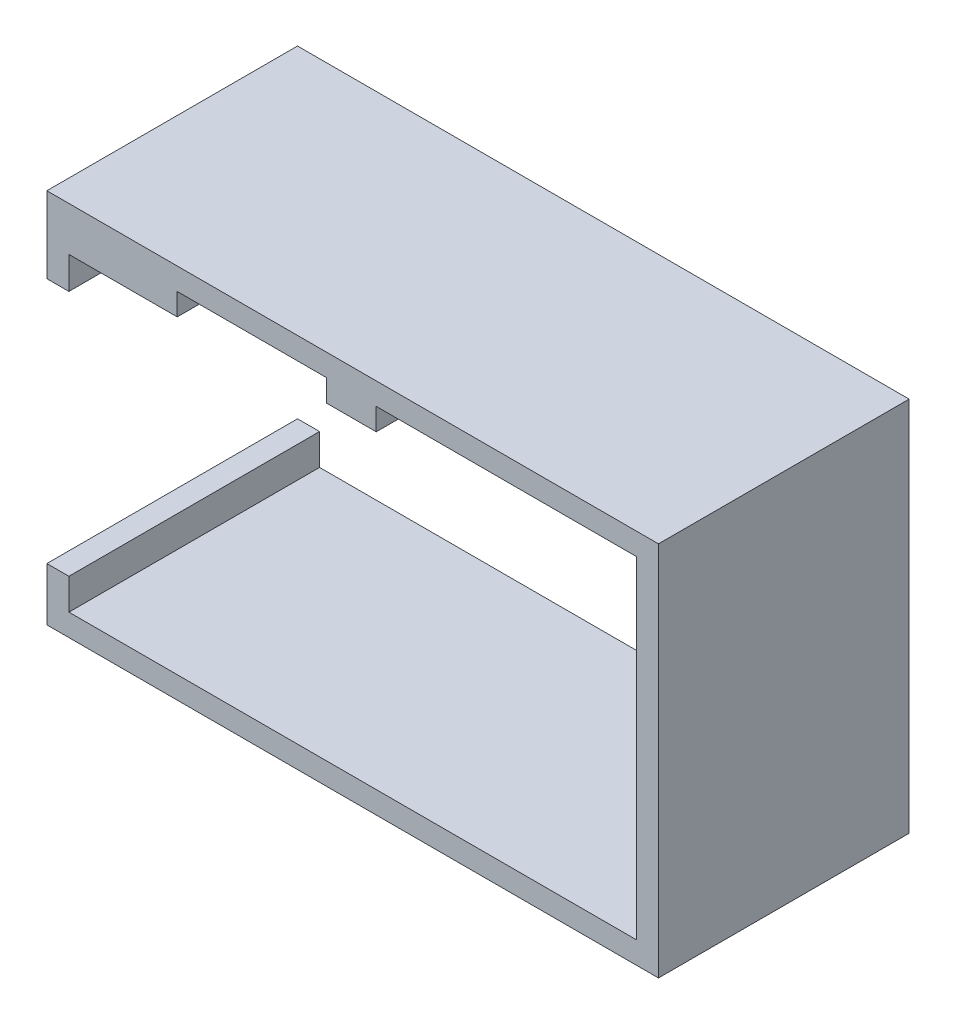
ISO-10303-21;
HEADER;
FILE_DESCRIPTION(('STEP AP214'),'2;1');
FILE_NAME('part.step','',(''),(''),'','','');
FILE_SCHEMA(('AUTOMOTIVE_DESIGN { 1 0 10303 214 1 1 1 1 }'));
ENDSEC;
DATA;
#1=APPLICATION_CONTEXT('core data for automotive mechanical design processes');
#2=APPLICATION_PROTOCOL_DEFINITION('international standard','automotive_design',2000,#1);
#3=PRODUCT_CONTEXT('',#1,'mechanical');
#4=PRODUCT('Part','Part','',(#3));
#5=PRODUCT_RELATED_PRODUCT_CATEGORY('part','',(#4));
#6=PRODUCT_DEFINITION_FORMATION('','',#4);
#7=PRODUCT_DEFINITION_CONTEXT('part definition',#1,'design');
#8=PRODUCT_DEFINITION('design','',#6,#7);
#9=PRODUCT_DEFINITION_SHAPE('','',#8);
#10=(LENGTH_UNIT() NAMED_UNIT(*) SI_UNIT(.MILLI.,.METRE.));
#11=(NAMED_UNIT(*) PLANE_ANGLE_UNIT() SI_UNIT($,.RADIAN.));
#12=(NAMED_UNIT(*) SI_UNIT($,.STERADIAN.) SOLID_ANGLE_UNIT());
#13=UNCERTAINTY_MEASURE_WITH_UNIT(LENGTH_MEASURE(1.E-05),#10,'distance_accuracy_value','');
#14=(GEOMETRIC_REPRESENTATION_CONTEXT(3) GLOBAL_UNCERTAINTY_ASSIGNED_CONTEXT((#13)) GLOBAL_UNIT_ASSIGNED_CONTEXT((#10,
#11,#12)) REPRESENTATION_CONTEXT('',''));
#15=CARTESIAN_POINT('',(0.,0.,0.));
#16=DIRECTION('',(0.,0.,1.));
#17=DIRECTION('',(1.,0.,0.));
#18=AXIS2_PLACEMENT_3D('',#15,#16,#17);
#19=CARTESIAN_POINT('',(0.,310.,2500.));
#20=DIRECTION('',(-1.,0.,0.));
#21=DIRECTION('',(0.,-1.,0.));
#22=AXIS2_PLACEMENT_3D('',#19,#20,#21);
#23=PLANE('',#22);
#24=DIRECTION('',(0.,1.,0.));
#25=VECTOR('',#24,1.);
#26=CARTESIAN_POINT('',(0.,310.,0.));
#27=LINE('',#26,#25);
#28=CARTESIAN_POINT('',(0.,0.,0.));
#29=VERTEX_POINT('',#28);
#30=CARTESIAN_POINT('',(0.,310.,0.));
#31=VERTEX_POINT('',#30);
#32=EDGE_CURVE('E189',#29,#31,#27,.T.);
#33=ORIENTED_EDGE('',*,*,#32,.T.);
#34=DIRECTION('',(0.,0.,-1.));
#35=VECTOR('',#34,1.);
#36=CARTESIAN_POINT('',(0.,310.,2500.));
#37=LINE('',#36,#35);
#38=CARTESIAN_POINT('',(0.,310.,2500.));
#39=VERTEX_POINT('',#38);
#40=EDGE_CURVE('E11',#39,#31,#37,.T.);
#41=ORIENTED_EDGE('',*,*,#40,.F.);
#42=DIRECTION('',(0.,1.,0.));
#43=VECTOR('',#42,1.);
#44=CARTESIAN_POINT('',(0.,310.,2500.));
#45=LINE('',#44,#43);
#46=CARTESIAN_POINT('',(0.,0.,2500.));
#47=VERTEX_POINT('',#46);
#48=EDGE_CURVE('E223',#47,#39,#45,.T.);
#49=ORIENTED_EDGE('',*,*,#48,.F.);
#50=DIRECTION('',(0.,0.,-1.));
#51=VECTOR('',#50,1.);
#52=CARTESIAN_POINT('',(0.,0.,2500.));
#53=LINE('',#52,#51);
#54=EDGE_CURVE('E185',#47,#29,#53,.T.);
#55=ORIENTED_EDGE('',*,*,#54,.T.);
#56=EDGE_LOOP('',(#33,#41,#49,#55));
#57=FACE_BOUND('',#56,.T.);
#58=ADVANCED_FACE('F33',(#57),#23,.F.);
#59=CARTESIAN_POINT('',(-220.,310.,2500.));
#60=DIRECTION('',(0.,-1.,0.));
#61=DIRECTION('',(0.,0.,-1.));
#62=AXIS2_PLACEMENT_3D('',#59,#60,#61);
#63=PLANE('',#62);
#64=DIRECTION('',(-1.,0.,0.));
#65=VECTOR('',#64,1.);
#66=CARTESIAN_POINT('',(-220.,310.,0.));
#67=LINE('',#66,#65);
#68=CARTESIAN_POINT('',(-220.,310.,0.));
#69=VERTEX_POINT('',#68);
#70=EDGE_CURVE('E192',#31,#69,#67,.T.);
#71=ORIENTED_EDGE('',*,*,#70,.T.);
#72=DIRECTION('',(0.,0.,-1.));
#73=VECTOR('',#72,1.);
#74=CARTESIAN_POINT('',(-220.,310.,2500.));
#75=LINE('',#74,#73);
#76=CARTESIAN_POINT('',(-220.,310.,2500.));
#77=VERTEX_POINT('',#76);
#78=EDGE_CURVE('E41',#77,#69,#75,.T.);
#79=ORIENTED_EDGE('',*,*,#78,.F.);
#80=DIRECTION('',(-1.,0.,0.));
#81=VECTOR('',#80,1.);
#82=CARTESIAN_POINT('',(-220.,310.,2500.));
#83=LINE('',#82,#81);
#84=EDGE_CURVE('E122',#39,#77,#83,.T.);
#85=ORIENTED_EDGE('',*,*,#84,.F.);
#86=ORIENTED_EDGE('',*,*,#40,.T.);
#87=EDGE_LOOP('',(#71,#79,#85,#86));
#88=FACE_BOUND('',#87,.T.);
#89=ADVANCED_FACE('F331',(#88),#63,.F.);
#90=CARTESIAN_POINT('',(-220.,-220.000000000001,2500.));
#91=DIRECTION('',(1.,0.,0.));
#92=DIRECTION('',(0.,1.,0.));
#93=AXIS2_PLACEMENT_3D('',#90,#91,#92);
#94=PLANE('',#93);
#95=DIRECTION('',(0.,-1.,0.));
#96=VECTOR('',#95,1.);
#97=CARTESIAN_POINT('',(-220.,-220.000000000001,0.));
#98=LINE('',#97,#96);
#99=CARTESIAN_POINT('',(-220.,-220.000000000001,0.));
#100=VERTEX_POINT('',#99);
#101=EDGE_CURVE('E194',#69,#100,#98,.T.);
#102=ORIENTED_EDGE('',*,*,#101,.T.);
#103=DIRECTION('',(0.,0.,-1.));
#104=VECTOR('',#103,1.);
#105=CARTESIAN_POINT('',(-220.,-220.000000000001,2500.));
#106=LINE('',#105,#104);
#107=CARTESIAN_POINT('',(-220.,-220.000000000001,2500.));
#108=VERTEX_POINT('',#107);
#109=EDGE_CURVE('E260',#108,#100,#106,.T.);
#110=ORIENTED_EDGE('',*,*,#109,.F.);
#111=DIRECTION('',(0.,-1.,0.));
#112=VECTOR('',#111,1.);
#113=CARTESIAN_POINT('',(-220.,-220.000000000001,2500.));
#114=LINE('',#113,#112);
#115=EDGE_CURVE('E268',#77,#108,#114,.T.);
#116=ORIENTED_EDGE('',*,*,#115,.F.);
#117=ORIENTED_EDGE('',*,*,#78,.T.);
#118=EDGE_LOOP('',(#102,#110,#116,#117));
#119=FACE_BOUND('',#118,.T.);
#120=ADVANCED_FACE('F266',(#119),#94,.F.);
#121=CARTESIAN_POINT('',(5880.,-220.,2500.));
#122=DIRECTION('',(0.,1.,0.));
#123=DIRECTION('',(-1.,0.,0.));
#124=AXIS2_PLACEMENT_3D('',#121,#122,#123);
#125=PLANE('',#124);
#126=DIRECTION('',(1.,0.,0.));
#127=VECTOR('',#126,1.);
#128=CARTESIAN_POINT('',(5880.,-220.,0.));
#129=LINE('',#128,#127);
#130=CARTESIAN_POINT('',(5880.,-220.,0.));
#131=VERTEX_POINT('',#130);
#132=EDGE_CURVE('E196',#100,#131,#129,.T.);
#133=ORIENTED_EDGE('',*,*,#132,.T.);
#134=DIRECTION('',(0.,0.,-1.));
#135=VECTOR('',#134,1.);
#136=CARTESIAN_POINT('',(5880.,-220.,2500.));
#137=LINE('',#136,#135);
#138=CARTESIAN_POINT('',(5880.,-220.,2500.));
#139=VERTEX_POINT('',#138);
#140=EDGE_CURVE('E257',#139,#131,#137,.T.);
#141=ORIENTED_EDGE('',*,*,#140,.F.);
#142=DIRECTION('',(1.,0.,0.));
#143=VECTOR('',#142,1.);
#144=CARTESIAN_POINT('',(5880.,-220.,2500.));
#145=LINE('',#144,#143);
#146=EDGE_CURVE('E286',#108,#139,#145,.T.);
#147=ORIENTED_EDGE('',*,*,#146,.F.);
#148=ORIENTED_EDGE('',*,*,#109,.T.);
#149=EDGE_LOOP('',(#133,#141,#147,#148));
#150=FACE_BOUND('',#149,.T.);
#151=ADVANCED_FACE('F277',(#150),#125,.F.);
#152=CARTESIAN_POINT('',(5880.,3530.,2500.));
#153=DIRECTION('',(-1.,0.,0.));
#154=DIRECTION('',(0.,-1.,0.));
#155=AXIS2_PLACEMENT_3D('',#152,#153,#154);
#156=PLANE('',#155);
#157=DIRECTION('',(0.,1.,0.));
#158=VECTOR('',#157,1.);
#159=CARTESIAN_POINT('',(5880.,3530.,0.));
#160=LINE('',#159,#158);
#161=CARTESIAN_POINT('',(5880.,3530.,0.));
#162=VERTEX_POINT('',#161);
#163=EDGE_CURVE('E198',#131,#162,#160,.T.);
#164=ORIENTED_EDGE('',*,*,#163,.T.);
#165=DIRECTION('',(0.,0.,-1.));
#166=VECTOR('',#165,1.);
#167=CARTESIAN_POINT('',(5880.,3530.,2500.));
#168=LINE('',#167,#166);
#169=CARTESIAN_POINT('',(5880.,3530.,2500.));
#170=VERTEX_POINT('',#169);
#171=EDGE_CURVE('E254',#170,#162,#168,.T.);
#172=ORIENTED_EDGE('',*,*,#171,.F.);
#173=DIRECTION('',(0.,1.,0.));
#174=VECTOR('',#173,1.);
#175=CARTESIAN_POINT('',(5880.,3530.,2500.));
#176=LINE('',#175,#174);
#177=EDGE_CURVE('E283',#139,#170,#176,.T.);
#178=ORIENTED_EDGE('',*,*,#177,.F.);
#179=ORIENTED_EDGE('',*,*,#140,.T.);
#180=EDGE_LOOP('',(#164,#172,#178,#179));
#181=FACE_BOUND('',#180,.T.);
#182=ADVANCED_FACE('F281',(#181),#156,.F.);
#183=CARTESIAN_POINT('',(-220.,3530.,2500.));
#184=DIRECTION('',(0.,-1.,0.));
#185=DIRECTION('',(0.,0.,-1.));
#186=AXIS2_PLACEMENT_3D('',#183,#184,#185);
#187=PLANE('',#186);
#188=DIRECTION('',(-1.,0.,0.));
#189=VECTOR('',#188,1.);
#190=CARTESIAN_POINT('',(-220.,3530.,0.));
#191=LINE('',#190,#189);
#192=CARTESIAN_POINT('',(-220.,3530.,0.));
#193=VERTEX_POINT('',#192);
#194=EDGE_CURVE('E200',#162,#193,#191,.T.);
#195=ORIENTED_EDGE('',*,*,#194,.T.);
#196=DIRECTION('',(0.,0.,-1.));
#197=VECTOR('',#196,1.);
#198=CARTESIAN_POINT('',(-220.,3530.,2500.));
#199=LINE('',#198,#197);
#200=CARTESIAN_POINT('',(-220.,3530.,2500.));
#201=VERTEX_POINT('',#200);
#202=EDGE_CURVE('E251',#201,#193,#199,.T.);
#203=ORIENTED_EDGE('',*,*,#202,.F.);
#204=DIRECTION('',(-1.,0.,0.));
#205=VECTOR('',#204,1.);
#206=CARTESIAN_POINT('',(-220.,3530.,2500.));
#207=LINE('',#206,#205);
#208=EDGE_CURVE('E285',#170,#201,#207,.T.);
#209=ORIENTED_EDGE('',*,*,#208,.F.);
#210=ORIENTED_EDGE('',*,*,#171,.T.);
#211=EDGE_LOOP('',(#195,#203,#209,#210));
#212=FACE_BOUND('',#211,.T.);
#213=ADVANCED_FACE('F344',(#212),#187,.F.);
#214=CARTESIAN_POINT('',(-220.,2770.,2500.));
#215=DIRECTION('',(1.,0.,0.));
#216=DIRECTION('',(0.,0.,-1.));
#217=AXIS2_PLACEMENT_3D('',#214,#215,#216);
#218=PLANE('',#217);
#219=DIRECTION('',(0.,-1.,0.));
#220=VECTOR('',#219,1.);
#221=CARTESIAN_POINT('',(-220.,2770.,0.));
#222=LINE('',#221,#220);
#223=CARTESIAN_POINT('',(-220.,2770.,0.));
#224=VERTEX_POINT('',#223);
#225=EDGE_CURVE('E202',#193,#224,#222,.T.);
#226=ORIENTED_EDGE('',*,*,#225,.T.);
#227=DIRECTION('',(0.,0.,-1.));
#228=VECTOR('',#227,1.);
#229=CARTESIAN_POINT('',(-220.,2770.,2500.));
#230=LINE('',#229,#228);
#231=CARTESIAN_POINT('',(-220.,2770.,2500.));
#232=VERTEX_POINT('',#231);
#233=EDGE_CURVE('E248',#232,#224,#230,.T.);
#234=ORIENTED_EDGE('',*,*,#233,.F.);
#235=DIRECTION('',(0.,-1.,0.));
#236=VECTOR('',#235,1.);
#237=CARTESIAN_POINT('',(-220.,2770.,2500.));
#238=LINE('',#237,#236);
#239=EDGE_CURVE('E288',#201,#232,#238,.T.);
#240=ORIENTED_EDGE('',*,*,#239,.F.);
#241=ORIENTED_EDGE('',*,*,#202,.T.);
#242=EDGE_LOOP('',(#226,#234,#240,#241));
#243=FACE_BOUND('',#242,.T.);
#244=ADVANCED_FACE('F347',(#243),#218,.F.);
#245=CARTESIAN_POINT('',(-3.05311331771918E-13,2770.,2500.));
#246=DIRECTION('',(0.,1.,0.));
#247=DIRECTION('',(-1.,0.,0.));
#248=AXIS2_PLACEMENT_3D('',#245,#246,#247);
#249=PLANE('',#248);
#250=DIRECTION('',(1.,0.,0.));
#251=VECTOR('',#250,1.);
#252=CARTESIAN_POINT('',(-3.05311331771918E-13,2770.,0.));
#253=LINE('',#252,#251);
#254=CARTESIAN_POINT('',(-3.05311331771918E-13,2770.,0.));
#255=VERTEX_POINT('',#254);
#256=EDGE_CURVE('E204',#224,#255,#253,.T.);
#257=ORIENTED_EDGE('',*,*,#256,.T.);
#258=DIRECTION('',(0.,0.,-1.));
#259=VECTOR('',#258,1.);
#260=CARTESIAN_POINT('',(-3.05311331771918E-13,2770.,2500.));
#261=LINE('',#260,#259);
#262=CARTESIAN_POINT('',(-3.05311331771918E-13,2770.,2500.));
#263=VERTEX_POINT('',#262);
#264=EDGE_CURVE('E245',#263,#255,#261,.T.);
#265=ORIENTED_EDGE('',*,*,#264,.F.);
#266=DIRECTION('',(1.,0.,0.));
#267=VECTOR('',#266,1.);
#268=CARTESIAN_POINT('',(-3.05311331771918E-13,2770.,2500.));
#269=LINE('',#268,#267);
#270=EDGE_CURVE('E294',#232,#263,#269,.T.);
#271=ORIENTED_EDGE('',*,*,#270,.F.);
#272=ORIENTED_EDGE('',*,*,#233,.T.);
#273=EDGE_LOOP('',(#257,#265,#271,#272));
#274=FACE_BOUND('',#273,.T.);
#275=ADVANCED_FACE('F351',(#274),#249,.F.);
#276=CARTESIAN_POINT('',(-9.43689570931383E-13,3090.,2500.));
#277=DIRECTION('',(-1.,0.,0.));
#278=DIRECTION('',(0.,-1.,0.));
#279=AXIS2_PLACEMENT_3D('',#276,#277,#278);
#280=PLANE('',#279);
#281=DIRECTION('',(0.,1.,0.));
#282=VECTOR('',#281,1.);
#283=CARTESIAN_POINT('',(-9.43689570931383E-13,3090.,0.));
#284=LINE('',#283,#282);
#285=CARTESIAN_POINT('',(-9.43689570931383E-13,3090.,0.));
#286=VERTEX_POINT('',#285);
#287=EDGE_CURVE('E206',#255,#286,#284,.T.);
#288=ORIENTED_EDGE('',*,*,#287,.T.);
#289=DIRECTION('',(0.,0.,-1.));
#290=VECTOR('',#289,1.);
#291=CARTESIAN_POINT('',(-9.43689570931383E-13,3090.,2500.));
#292=LINE('',#291,#290);
#293=CARTESIAN_POINT('',(-9.43689570931383E-13,3090.,2500.));
#294=VERTEX_POINT('',#293);
#295=EDGE_CURVE('E242',#294,#286,#292,.T.);
#296=ORIENTED_EDGE('',*,*,#295,.F.);
#297=DIRECTION('',(0.,1.,0.));
#298=VECTOR('',#297,1.);
#299=CARTESIAN_POINT('',(-9.43689570931383E-13,3090.,2500.));
#300=LINE('',#299,#298);
#301=EDGE_CURVE('E296',#263,#294,#300,.T.);
#302=ORIENTED_EDGE('',*,*,#301,.F.);
#303=ORIENTED_EDGE('',*,*,#264,.T.);
#304=EDGE_LOOP('',(#288,#296,#302,#303));
#305=FACE_BOUND('',#304,.T.);
#306=ADVANCED_FACE('F355',(#305),#280,.F.);
#307=CARTESIAN_POINT('',(1080.,3090.,2500.));
#308=DIRECTION('',(0.,1.,0.));
#309=DIRECTION('',(0.,0.,1.));
#310=AXIS2_PLACEMENT_3D('',#307,#308,#309);
#311=PLANE('',#310);
#312=DIRECTION('',(1.,0.,0.));
#313=VECTOR('',#312,1.);
#314=CARTESIAN_POINT('',(1080.,3090.,0.));
#315=LINE('',#314,#313);
#316=CARTESIAN_POINT('',(1080.,3090.,0.));
#317=VERTEX_POINT('',#316);
#318=EDGE_CURVE('E208',#286,#317,#315,.T.);
#319=ORIENTED_EDGE('',*,*,#318,.T.);
#320=DIRECTION('',(0.,0.,-1.));
#321=VECTOR('',#320,1.);
#322=CARTESIAN_POINT('',(1080.,3090.,2500.));
#323=LINE('',#322,#321);
#324=CARTESIAN_POINT('',(1080.,3090.,2500.));
#325=VERTEX_POINT('',#324);
#326=EDGE_CURVE('E239',#325,#317,#323,.T.);
#327=ORIENTED_EDGE('',*,*,#326,.F.);
#328=DIRECTION('',(1.,0.,0.));
#329=VECTOR('',#328,1.);
#330=CARTESIAN_POINT('',(1080.,3090.,2500.));
#331=LINE('',#330,#329);
#332=EDGE_CURVE('E298',#294,#325,#331,.T.);
#333=ORIENTED_EDGE('',*,*,#332,.F.);
#334=ORIENTED_EDGE('',*,*,#295,.T.);
#335=EDGE_LOOP('',(#319,#327,#333,#334));
#336=FACE_BOUND('',#335,.T.);
#337=ADVANCED_FACE('F359',(#336),#311,.F.);
#338=CARTESIAN_POINT('',(1080.,3310.,2500.));
#339=DIRECTION('',(-1.,0.,0.));
#340=DIRECTION('',(0.,0.,1.));
#341=AXIS2_PLACEMENT_3D('',#338,#339,#340);
#342=PLANE('',#341);
#343=DIRECTION('',(0.,1.,0.));
#344=VECTOR('',#343,1.);
#345=CARTESIAN_POINT('',(1080.,3310.,0.));
#346=LINE('',#345,#344);
#347=CARTESIAN_POINT('',(1080.,3310.,0.));
#348=VERTEX_POINT('',#347);
#349=EDGE_CURVE('E210',#317,#348,#346,.T.);
#350=ORIENTED_EDGE('',*,*,#349,.T.);
#351=DIRECTION('',(0.,0.,-1.));
#352=VECTOR('',#351,1.);
#353=CARTESIAN_POINT('',(1080.,3310.,2500.));
#354=LINE('',#353,#352);
#355=CARTESIAN_POINT('',(1080.,3310.,2500.));
#356=VERTEX_POINT('',#355);
#357=EDGE_CURVE('E236',#356,#348,#354,.T.);
#358=ORIENTED_EDGE('',*,*,#357,.F.);
#359=DIRECTION('',(0.,1.,0.));
#360=VECTOR('',#359,1.);
#361=CARTESIAN_POINT('',(1080.,3310.,2500.));
#362=LINE('',#361,#360);
#363=EDGE_CURVE('E300',#325,#356,#362,.T.);
#364=ORIENTED_EDGE('',*,*,#363,.F.);
#365=ORIENTED_EDGE('',*,*,#326,.T.);
#366=EDGE_LOOP('',(#350,#358,#364,#365));
#367=FACE_BOUND('',#366,.T.);
#368=ADVANCED_FACE('F363',(#367),#342,.F.);
#369=CARTESIAN_POINT('',(2570.,3310.,2500.));
#370=DIRECTION('',(0.,1.,0.));
#371=DIRECTION('',(0.,0.,1.));
#372=AXIS2_PLACEMENT_3D('',#369,#370,#371);
#373=PLANE('',#372);
#374=DIRECTION('',(1.,0.,0.));
#375=VECTOR('',#374,1.);
#376=CARTESIAN_POINT('',(2570.,3310.,0.));
#377=LINE('',#376,#375);
#378=CARTESIAN_POINT('',(2570.,3310.,0.));
#379=VERTEX_POINT('',#378);
#380=EDGE_CURVE('E212',#348,#379,#377,.T.);
#381=ORIENTED_EDGE('',*,*,#380,.T.);
#382=DIRECTION('',(0.,0.,-1.));
#383=VECTOR('',#382,1.);
#384=CARTESIAN_POINT('',(2570.,3310.,2500.));
#385=LINE('',#384,#383);
#386=CARTESIAN_POINT('',(2570.,3310.,2500.));
#387=VERTEX_POINT('',#386);
#388=EDGE_CURVE('E233',#387,#379,#385,.T.);
#389=ORIENTED_EDGE('',*,*,#388,.F.);
#390=DIRECTION('',(1.,0.,0.));
#391=VECTOR('',#390,1.);
#392=CARTESIAN_POINT('',(2570.,3310.,2500.));
#393=LINE('',#392,#391);
#394=EDGE_CURVE('E302',#356,#387,#393,.T.);
#395=ORIENTED_EDGE('',*,*,#394,.F.);
#396=ORIENTED_EDGE('',*,*,#357,.T.);
#397=EDGE_LOOP('',(#381,#389,#395,#396));
#398=FACE_BOUND('',#397,.T.);
#399=ADVANCED_FACE('F367',(#398),#373,.F.);
#400=CARTESIAN_POINT('',(2570.,3090.,2500.));
#401=DIRECTION('',(1.,0.,0.));
#402=DIRECTION('',(0.,0.,-1.));
#403=AXIS2_PLACEMENT_3D('',#400,#401,#402);
#404=PLANE('',#403);
#405=DIRECTION('',(0.,-1.,0.));
#406=VECTOR('',#405,1.);
#407=CARTESIAN_POINT('',(2570.,3090.,0.));
#408=LINE('',#407,#406);
#409=CARTESIAN_POINT('',(2570.,3090.,0.));
#410=VERTEX_POINT('',#409);
#411=EDGE_CURVE('E214',#379,#410,#408,.T.);
#412=ORIENTED_EDGE('',*,*,#411,.T.);
#413=DIRECTION('',(0.,0.,-1.));
#414=VECTOR('',#413,1.);
#415=CARTESIAN_POINT('',(2570.,3090.,2500.));
#416=LINE('',#415,#414);
#417=CARTESIAN_POINT('',(2570.,3090.,2500.));
#418=VERTEX_POINT('',#417);
#419=EDGE_CURVE('E230',#418,#410,#416,.T.);
#420=ORIENTED_EDGE('',*,*,#419,.F.);
#421=DIRECTION('',(0.,-1.,0.));
#422=VECTOR('',#421,1.);
#423=CARTESIAN_POINT('',(2570.,3090.,2500.));
#424=LINE('',#423,#422);
#425=EDGE_CURVE('E304',#387,#418,#424,.T.);
#426=ORIENTED_EDGE('',*,*,#425,.F.);
#427=ORIENTED_EDGE('',*,*,#388,.T.);
#428=EDGE_LOOP('',(#412,#420,#426,#427));
#429=FACE_BOUND('',#428,.T.);
#430=ADVANCED_FACE('F371',(#429),#404,.F.);
#431=CARTESIAN_POINT('',(3065.,3090.,2500.));
#432=DIRECTION('',(0.,1.,0.));
#433=DIRECTION('',(0.,0.,1.));
#434=AXIS2_PLACEMENT_3D('',#431,#432,#433);
#435=PLANE('',#434);
#436=DIRECTION('',(1.,0.,0.));
#437=VECTOR('',#436,1.);
#438=CARTESIAN_POINT('',(3065.,3090.,0.));
#439=LINE('',#438,#437);
#440=CARTESIAN_POINT('',(3065.,3090.,0.));
#441=VERTEX_POINT('',#440);
#442=EDGE_CURVE('E216',#410,#441,#439,.T.);
#443=ORIENTED_EDGE('',*,*,#442,.T.);
#444=DIRECTION('',(0.,0.,-1.));
#445=VECTOR('',#444,1.);
#446=CARTESIAN_POINT('',(3065.,3090.,2500.));
#447=LINE('',#446,#445);
#448=CARTESIAN_POINT('',(3065.,3090.,2500.));
#449=VERTEX_POINT('',#448);
#450=EDGE_CURVE('E227',#449,#441,#447,.T.);
#451=ORIENTED_EDGE('',*,*,#450,.F.);
#452=DIRECTION('',(1.,0.,0.));
#453=VECTOR('',#452,1.);
#454=CARTESIAN_POINT('',(3065.,3090.,2500.));
#455=LINE('',#454,#453);
#456=EDGE_CURVE('E306',#418,#449,#455,.T.);
#457=ORIENTED_EDGE('',*,*,#456,.F.);
#458=ORIENTED_EDGE('',*,*,#419,.T.);
#459=EDGE_LOOP('',(#443,#451,#457,#458));
#460=FACE_BOUND('',#459,.T.);
#461=ADVANCED_FACE('F312',(#460),#435,.F.);
#462=CARTESIAN_POINT('',(3065.,3310.,2500.));
#463=DIRECTION('',(-1.,0.,0.));
#464=DIRECTION('',(0.,0.,1.));
#465=AXIS2_PLACEMENT_3D('',#462,#463,#464);
#466=PLANE('',#465);
#467=DIRECTION('',(0.,1.,0.));
#468=VECTOR('',#467,1.);
#469=CARTESIAN_POINT('',(3065.,3310.,0.));
#470=LINE('',#469,#468);
#471=CARTESIAN_POINT('',(3065.,3310.,0.));
#472=VERTEX_POINT('',#471);
#473=EDGE_CURVE('E218',#441,#472,#470,.T.);
#474=ORIENTED_EDGE('',*,*,#473,.T.);
#475=DIRECTION('',(0.,0.,-1.));
#476=VECTOR('',#475,1.);
#477=CARTESIAN_POINT('',(3065.,3310.,2500.));
#478=LINE('',#477,#476);
#479=CARTESIAN_POINT('',(3065.,3310.,2500.));
#480=VERTEX_POINT('',#479);
#481=EDGE_CURVE('E180',#480,#472,#478,.T.);
#482=ORIENTED_EDGE('',*,*,#481,.F.);
#483=DIRECTION('',(0.,1.,0.));
#484=VECTOR('',#483,1.);
#485=CARTESIAN_POINT('',(3065.,3310.,2500.));
#486=LINE('',#485,#484);
#487=EDGE_CURVE('E171',#449,#480,#486,.T.);
#488=ORIENTED_EDGE('',*,*,#487,.F.);
#489=ORIENTED_EDGE('',*,*,#450,.T.);
#490=EDGE_LOOP('',(#474,#482,#488,#489));
#491=FACE_BOUND('',#490,.T.);
#492=ADVANCED_FACE('F316',(#491),#466,.F.);
#493=CARTESIAN_POINT('',(5660.,3310.,2500.));
#494=DIRECTION('',(0.,1.,0.));
#495=DIRECTION('',(-1.,0.,0.));
#496=AXIS2_PLACEMENT_3D('',#493,#494,#495);
#497=PLANE('',#496);
#498=DIRECTION('',(1.,0.,0.));
#499=VECTOR('',#498,1.);
#500=CARTESIAN_POINT('',(5660.,3310.,0.));
#501=LINE('',#500,#499);
#502=CARTESIAN_POINT('',(5660.,3310.,0.));
#503=VERTEX_POINT('',#502);
#504=EDGE_CURVE('E179',#472,#503,#501,.T.);
#505=ORIENTED_EDGE('',*,*,#504,.T.);
#506=DIRECTION('',(0.,0.,-1.));
#507=VECTOR('',#506,1.);
#508=CARTESIAN_POINT('',(5660.,3310.,2500.));
#509=LINE('',#508,#507);
#510=CARTESIAN_POINT('',(5660.,3310.,2500.));
#511=VERTEX_POINT('',#510);
#512=EDGE_CURVE('E176',#511,#503,#509,.T.);
#513=ORIENTED_EDGE('',*,*,#512,.F.);
#514=DIRECTION('',(1.,0.,0.));
#515=VECTOR('',#514,1.);
#516=CARTESIAN_POINT('',(5660.,3310.,2500.));
#517=LINE('',#516,#515);
#518=EDGE_CURVE('E165',#480,#511,#517,.T.);
#519=ORIENTED_EDGE('',*,*,#518,.F.);
#520=ORIENTED_EDGE('',*,*,#481,.T.);
#521=EDGE_LOOP('',(#505,#513,#519,#520));
#522=FACE_BOUND('',#521,.T.);
#523=ADVANCED_FACE('F177',(#522),#497,.F.);
#524=CARTESIAN_POINT('',(5660.,0.,2500.));
#525=DIRECTION('',(1.,0.,0.));
#526=DIRECTION('',(0.,0.,-1.));
#527=AXIS2_PLACEMENT_3D('',#524,#525,#526);
#528=PLANE('',#527);
#529=DIRECTION('',(0.,-1.,0.));
#530=VECTOR('',#529,1.);
#531=CARTESIAN_POINT('',(5660.,0.,0.));
#532=LINE('',#531,#530);
#533=CARTESIAN_POINT('',(5660.,0.,0.));
#534=VERTEX_POINT('',#533);
#535=EDGE_CURVE('E108',#503,#534,#532,.T.);
#536=ORIENTED_EDGE('',*,*,#535,.T.);
#537=DIRECTION('',(0.,0.,-1.));
#538=VECTOR('',#537,1.);
#539=CARTESIAN_POINT('',(5660.,0.,2500.));
#540=LINE('',#539,#538);
#541=CARTESIAN_POINT('',(5660.,0.,2500.));
#542=VERTEX_POINT('',#541);
#543=EDGE_CURVE('E181',#542,#534,#540,.T.);
#544=ORIENTED_EDGE('',*,*,#543,.F.);
#545=DIRECTION('',(0.,-1.,0.));
#546=VECTOR('',#545,1.);
#547=CARTESIAN_POINT('',(5660.,0.,2500.));
#548=LINE('',#547,#546);
#549=EDGE_CURVE('E169',#511,#542,#548,.T.);
#550=ORIENTED_EDGE('',*,*,#549,.F.);
#551=ORIENTED_EDGE('',*,*,#512,.T.);
#552=EDGE_LOOP('',(#536,#544,#550,#551));
#553=FACE_BOUND('',#552,.T.);
#554=ADVANCED_FACE('F183',(#553),#528,.F.);
#555=CARTESIAN_POINT('',(0.,0.,2500.));
#556=DIRECTION('',(0.,-1.,0.));
#557=DIRECTION('',(0.,0.,-1.));
#558=AXIS2_PLACEMENT_3D('',#555,#556,#557);
#559=PLANE('',#558);
#560=DIRECTION('',(-1.,0.,0.));
#561=VECTOR('',#560,1.);
#562=CARTESIAN_POINT('',(0.,0.,0.));
#563=LINE('',#562,#561);
#564=EDGE_CURVE('E114',#534,#29,#563,.T.);
#565=ORIENTED_EDGE('',*,*,#564,.T.);
#566=ORIENTED_EDGE('',*,*,#54,.F.);
#567=DIRECTION('',(-1.,0.,0.));
#568=VECTOR('',#567,1.);
#569=CARTESIAN_POINT('',(0.,0.,2500.));
#570=LINE('',#569,#568);
#571=EDGE_CURVE('E49',#542,#47,#570,.T.);
#572=ORIENTED_EDGE('',*,*,#571,.F.);
#573=ORIENTED_EDGE('',*,*,#543,.T.);
#574=EDGE_LOOP('',(#565,#566,#572,#573));
#575=FACE_BOUND('',#574,.T.);
#576=ADVANCED_FACE('F320',(#575),#559,.F.);
#577=CARTESIAN_POINT('',(0.,0.,2500.));
#578=DIRECTION('',(0.,0.,1.));
#579=DIRECTION('',(1.,0.,0.));
#580=AXIS2_PLACEMENT_3D('',#577,#578,#579);
#581=PLANE('',#580);
#582=ORIENTED_EDGE('',*,*,#48,.T.);
#583=ORIENTED_EDGE('',*,*,#84,.T.);
#584=ORIENTED_EDGE('',*,*,#115,.T.);
#585=ORIENTED_EDGE('',*,*,#146,.T.);
#586=ORIENTED_EDGE('',*,*,#177,.T.);
#587=ORIENTED_EDGE('',*,*,#208,.T.);
#588=ORIENTED_EDGE('',*,*,#239,.T.);
#589=ORIENTED_EDGE('',*,*,#270,.T.);
#590=ORIENTED_EDGE('',*,*,#301,.T.);
#591=ORIENTED_EDGE('',*,*,#332,.T.);
#592=ORIENTED_EDGE('',*,*,#363,.T.);
#593=ORIENTED_EDGE('',*,*,#394,.T.);
#594=ORIENTED_EDGE('',*,*,#425,.T.);
#595=ORIENTED_EDGE('',*,*,#456,.T.);
#596=ORIENTED_EDGE('',*,*,#487,.T.);
#597=ORIENTED_EDGE('',*,*,#518,.T.);
#598=ORIENTED_EDGE('',*,*,#549,.T.);
#599=ORIENTED_EDGE('',*,*,#571,.T.);
#600=EDGE_LOOP('',(#582,#583,#584,#585,#586,#587,#588,#589,#590,#591,#592,#593,#594,#595,#596,
#597,#598,#599));
#601=FACE_BOUND('',#600,.T.);
#602=ADVANCED_FACE('F167',(#601),#581,.T.);
#603=CARTESIAN_POINT('',(0.,0.,0.));
#604=DIRECTION('',(0.,0.,1.));
#605=DIRECTION('',(1.,0.,0.));
#606=AXIS2_PLACEMENT_3D('',#603,#604,#605);
#607=PLANE('',#606);
#608=ORIENTED_EDGE('',*,*,#32,.F.);
#609=ORIENTED_EDGE('',*,*,#564,.F.);
#610=ORIENTED_EDGE('',*,*,#535,.F.);
#611=ORIENTED_EDGE('',*,*,#504,.F.);
#612=ORIENTED_EDGE('',*,*,#473,.F.);
#613=ORIENTED_EDGE('',*,*,#442,.F.);
#614=ORIENTED_EDGE('',*,*,#411,.F.);
#615=ORIENTED_EDGE('',*,*,#380,.F.);
#616=ORIENTED_EDGE('',*,*,#349,.F.);
#617=ORIENTED_EDGE('',*,*,#318,.F.);
#618=ORIENTED_EDGE('',*,*,#287,.F.);
#619=ORIENTED_EDGE('',*,*,#256,.F.);
#620=ORIENTED_EDGE('',*,*,#225,.F.);
#621=ORIENTED_EDGE('',*,*,#194,.F.);
#622=ORIENTED_EDGE('',*,*,#163,.F.);
#623=ORIENTED_EDGE('',*,*,#132,.F.);
#624=ORIENTED_EDGE('',*,*,#101,.F.);
#625=ORIENTED_EDGE('',*,*,#70,.F.);
#626=EDGE_LOOP('',(#608,#609,#610,#611,#612,#613,#614,#615,#616,#617,#618,#619,#620,#621,#622,
#623,#624,#625));
#627=FACE_BOUND('',#626,.T.);
#628=ADVANCED_FACE('F272',(#627),#607,.F.);
#629=CLOSED_SHELL('',(#58,#89,#120,#151,#182,#213,#244,#275,#306,#337,#368,#399,#430,#461,#492,
#523,#554,#576,#602,#628));
#630=MANIFOLD_SOLID_BREP('B2',#629);
#631=ADVANCED_BREP_SHAPE_REPRESENTATION('',(#18,#630),#14);
#632=SHAPE_DEFINITION_REPRESENTATION(#9,#631);
ENDSEC;
END-ISO-10303-21;
